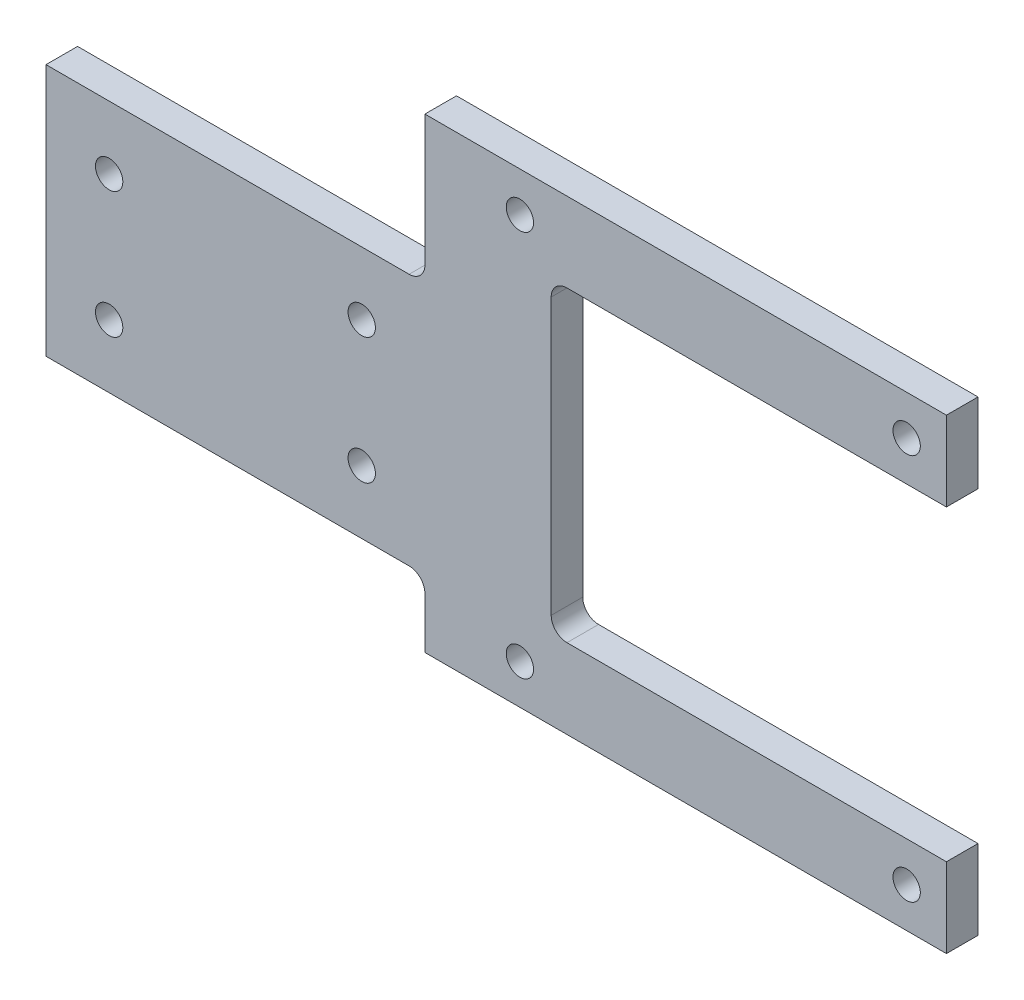
ISO-10303-21;
HEADER;
FILE_DESCRIPTION(('STEP AP214'),'2;1');
FILE_NAME('part.step','',(''),(''),'','','');
FILE_SCHEMA(('AUTOMOTIVE_DESIGN { 1 0 10303 214 1 1 1 1 }'));
ENDSEC;
DATA;
#1=APPLICATION_CONTEXT('core data for automotive mechanical design processes');
#2=APPLICATION_PROTOCOL_DEFINITION('international standard','automotive_design',2000,#1);
#3=PRODUCT_CONTEXT('',#1,'mechanical');
#4=PRODUCT('Part','Part','',(#3));
#5=PRODUCT_RELATED_PRODUCT_CATEGORY('part','',(#4));
#6=PRODUCT_DEFINITION_FORMATION('','',#4);
#7=PRODUCT_DEFINITION_CONTEXT('part definition',#1,'design');
#8=PRODUCT_DEFINITION('design','',#6,#7);
#9=PRODUCT_DEFINITION_SHAPE('','',#8);
#10=(LENGTH_UNIT() NAMED_UNIT(*) SI_UNIT(.MILLI.,.METRE.));
#11=(NAMED_UNIT(*) PLANE_ANGLE_UNIT() SI_UNIT($,.RADIAN.));
#12=(NAMED_UNIT(*) SI_UNIT($,.STERADIAN.) SOLID_ANGLE_UNIT());
#13=UNCERTAINTY_MEASURE_WITH_UNIT(LENGTH_MEASURE(1.E-05),#10,'distance_accuracy_value','');
#14=(GEOMETRIC_REPRESENTATION_CONTEXT(3) GLOBAL_UNCERTAINTY_ASSIGNED_CONTEXT((#13)) GLOBAL_UNIT_ASSIGNED_CONTEXT((#10,
#11,#12)) REPRESENTATION_CONTEXT('',''));
#15=CARTESIAN_POINT('',(0.,0.,0.));
#16=DIRECTION('',(0.,0.,1.));
#17=DIRECTION('',(1.,0.,0.));
#18=AXIS2_PLACEMENT_3D('',#15,#16,#17);
#19=CARTESIAN_POINT('',(-38.1,25.4,6.35));
#20=DIRECTION('',(1.,0.,0.));
#21=DIRECTION('',(0.,0.,-1.));
#22=AXIS2_PLACEMENT_3D('',#19,#20,#21);
#23=PLANE('',#22);
#24=DIRECTION('',(0.,-1.,0.));
#25=VECTOR('',#24,1.);
#26=CARTESIAN_POINT('',(-38.1,25.4,0.));
#27=LINE('',#26,#25);
#28=CARTESIAN_POINT('',(-38.1,25.4,0.));
#29=VERTEX_POINT('',#28);
#30=CARTESIAN_POINT('',(-38.1,-25.4,0.));
#31=VERTEX_POINT('',#30);
#32=EDGE_CURVE('E173',#29,#31,#27,.T.);
#33=ORIENTED_EDGE('',*,*,#32,.T.);
#34=DIRECTION('',(0.,0.,-1.));
#35=VECTOR('',#34,1.);
#36=CARTESIAN_POINT('',(-38.1,-25.4,6.35));
#37=LINE('',#36,#35);
#38=CARTESIAN_POINT('',(-38.1,-25.4,6.35));
#39=VERTEX_POINT('',#38);
#40=EDGE_CURVE('E154',#39,#31,#37,.T.);
#41=ORIENTED_EDGE('',*,*,#40,.F.);
#42=DIRECTION('',(0.,-1.,0.));
#43=VECTOR('',#42,1.);
#44=CARTESIAN_POINT('',(-38.1,25.4,6.35));
#45=LINE('',#44,#43);
#46=CARTESIAN_POINT('',(-38.1,25.4,6.35));
#47=VERTEX_POINT('',#46);
#48=EDGE_CURVE('E161',#47,#39,#45,.T.);
#49=ORIENTED_EDGE('',*,*,#48,.F.);
#50=DIRECTION('',(0.,0.,-1.));
#51=VECTOR('',#50,1.);
#52=CARTESIAN_POINT('',(-38.1,25.4,6.35));
#53=LINE('',#52,#51);
#54=EDGE_CURVE('E263',#47,#29,#53,.T.);
#55=ORIENTED_EDGE('',*,*,#54,.T.);
#56=EDGE_LOOP('',(#33,#41,#49,#55));
#57=FACE_BOUND('',#56,.T.);
#58=ADVANCED_FACE('F35',(#57),#23,.F.);
#59=CARTESIAN_POINT('',(38.1,-25.4,6.35));
#60=DIRECTION('',(0.,1.,0.));
#61=DIRECTION('',(0.,0.,1.));
#62=AXIS2_PLACEMENT_3D('',#59,#60,#61);
#63=PLANE('',#62);
#64=DIRECTION('',(1.,0.,0.));
#65=VECTOR('',#64,1.);
#66=CARTESIAN_POINT('',(38.1,-25.4,0.));
#67=LINE('',#66,#65);
#68=CARTESIAN_POINT('',(34.925,-25.4,0.));
#69=VERTEX_POINT('',#68);
#70=EDGE_CURVE('E236',#31,#69,#67,.T.);
#71=ORIENTED_EDGE('',*,*,#70,.T.);
#72=DIRECTION('',(0.,0.,-1.));
#73=VECTOR('',#72,1.);
#74=CARTESIAN_POINT('',(34.925,-25.4,6.35));
#75=LINE('',#74,#73);
#76=CARTESIAN_POINT('',(34.925,-25.4,6.35));
#77=VERTEX_POINT('',#76);
#78=EDGE_CURVE('E157',#69,#77,#75,.F.);
#79=ORIENTED_EDGE('',*,*,#78,.T.);
#80=DIRECTION('',(1.,0.,0.));
#81=VECTOR('',#80,1.);
#82=CARTESIAN_POINT('',(38.1,-25.4,6.35));
#83=LINE('',#82,#81);
#84=EDGE_CURVE('E149',#39,#77,#83,.T.);
#85=ORIENTED_EDGE('',*,*,#84,.F.);
#86=ORIENTED_EDGE('',*,*,#40,.T.);
#87=EDGE_LOOP('',(#71,#79,#85,#86));
#88=FACE_BOUND('',#87,.T.);
#89=ADVANCED_FACE('F152',(#88),#63,.F.);
#90=CARTESIAN_POINT('',(38.1,-38.8908729652601,6.35));
#91=DIRECTION('',(1.,0.,0.));
#92=DIRECTION('',(0.,0.,-1.));
#93=AXIS2_PLACEMENT_3D('',#90,#91,#92);
#94=PLANE('',#93);
#95=DIRECTION('',(0.,-1.,0.));
#96=VECTOR('',#95,1.);
#97=CARTESIAN_POINT('',(38.1,-38.8908729652601,6.35));
#98=LINE('',#97,#96);
#99=CARTESIAN_POINT('',(38.1,-28.575,6.35));
#100=VERTEX_POINT('',#99);
#101=CARTESIAN_POINT('',(38.1,-38.8908729652601,6.35));
#102=VERTEX_POINT('',#101);
#103=EDGE_CURVE('E160',#100,#102,#98,.T.);
#104=ORIENTED_EDGE('',*,*,#103,.F.);
#105=DIRECTION('',(0.,0.,-1.));
#106=VECTOR('',#105,1.);
#107=CARTESIAN_POINT('',(38.1,-28.575,0.));
#108=LINE('',#107,#106);
#109=CARTESIAN_POINT('',(38.1,-28.575,0.));
#110=VERTEX_POINT('',#109);
#111=EDGE_CURVE('E204',#100,#110,#108,.T.);
#112=ORIENTED_EDGE('',*,*,#111,.T.);
#113=DIRECTION('',(0.,-1.,0.));
#114=VECTOR('',#113,1.);
#115=CARTESIAN_POINT('',(38.1,-38.8908729652601,0.));
#116=LINE('',#115,#114);
#117=CARTESIAN_POINT('',(38.1,-38.8908729652601,0.));
#118=VERTEX_POINT('',#117);
#119=EDGE_CURVE('E238',#110,#118,#116,.T.);
#120=ORIENTED_EDGE('',*,*,#119,.T.);
#121=DIRECTION('',(0.,0.,-1.));
#122=VECTOR('',#121,1.);
#123=CARTESIAN_POINT('',(38.1,-38.8908729652601,6.35));
#124=LINE('',#123,#122);
#125=EDGE_CURVE('E175',#102,#118,#124,.T.);
#126=ORIENTED_EDGE('',*,*,#125,.F.);
#127=EDGE_LOOP('',(#104,#112,#120,#126));
#128=FACE_BOUND('',#127,.T.);
#129=ADVANCED_FACE('F229',(#128),#94,.F.);
#130=CARTESIAN_POINT('',(142.99087296526,-38.8908729652601,6.35));
#131=DIRECTION('',(0.,1.,0.));
#132=DIRECTION('',(-1.,0.,0.));
#133=AXIS2_PLACEMENT_3D('',#130,#131,#132);
#134=PLANE('',#133);
#135=DIRECTION('',(1.,0.,0.));
#136=VECTOR('',#135,1.);
#137=CARTESIAN_POINT('',(142.99087296526,-38.8908729652601,0.));
#138=LINE('',#137,#136);
#139=CARTESIAN_POINT('',(142.99087296526,-38.8908729652601,0.));
#140=VERTEX_POINT('',#139);
#141=EDGE_CURVE('E240',#118,#140,#138,.T.);
#142=ORIENTED_EDGE('',*,*,#141,.T.);
#143=DIRECTION('',(0.,0.,-1.));
#144=VECTOR('',#143,1.);
#145=CARTESIAN_POINT('',(142.99087296526,-38.8908729652601,6.35));
#146=LINE('',#145,#144);
#147=CARTESIAN_POINT('',(142.99087296526,-38.8908729652601,6.35));
#148=VERTEX_POINT('',#147);
#149=EDGE_CURVE('E181',#148,#140,#146,.T.);
#150=ORIENTED_EDGE('',*,*,#149,.F.);
#151=DIRECTION('',(1.,0.,0.));
#152=VECTOR('',#151,1.);
#153=CARTESIAN_POINT('',(142.99087296526,-38.8908729652601,6.35));
#154=LINE('',#153,#152);
#155=EDGE_CURVE('E232',#102,#148,#154,.T.);
#156=ORIENTED_EDGE('',*,*,#155,.F.);
#157=ORIENTED_EDGE('',*,*,#125,.T.);
#158=EDGE_LOOP('',(#142,#150,#156,#157));
#159=FACE_BOUND('',#158,.T.);
#160=ADVANCED_FACE('F418',(#159),#134,.F.);
#161=CARTESIAN_POINT('',(142.99087296526,-22.8908729652601,6.35));
#162=DIRECTION('',(-1.,0.,0.));
#163=DIRECTION('',(0.,0.,1.));
#164=AXIS2_PLACEMENT_3D('',#161,#162,#163);
#165=PLANE('',#164);
#166=DIRECTION('',(0.,1.,0.));
#167=VECTOR('',#166,1.);
#168=CARTESIAN_POINT('',(142.99087296526,-22.8908729652601,0.));
#169=LINE('',#168,#167);
#170=CARTESIAN_POINT('',(142.99087296526,-22.8908729652601,0.));
#171=VERTEX_POINT('',#170);
#172=EDGE_CURVE('E246',#140,#171,#169,.T.);
#173=ORIENTED_EDGE('',*,*,#172,.T.);
#174=DIRECTION('',(0.,0.,-1.));
#175=VECTOR('',#174,1.);
#176=CARTESIAN_POINT('',(142.99087296526,-22.8908729652601,6.35));
#177=LINE('',#176,#175);
#178=CARTESIAN_POINT('',(142.99087296526,-22.8908729652601,6.35));
#179=VERTEX_POINT('',#178);
#180=EDGE_CURVE('E274',#179,#171,#177,.T.);
#181=ORIENTED_EDGE('',*,*,#180,.F.);
#182=DIRECTION('',(0.,1.,0.));
#183=VECTOR('',#182,1.);
#184=CARTESIAN_POINT('',(142.99087296526,-22.8908729652601,6.35));
#185=LINE('',#184,#183);
#186=EDGE_CURVE('E283',#148,#179,#185,.T.);
#187=ORIENTED_EDGE('',*,*,#186,.F.);
#188=ORIENTED_EDGE('',*,*,#149,.T.);
#189=EDGE_LOOP('',(#173,#181,#187,#188));
#190=FACE_BOUND('',#189,.T.);
#191=ADVANCED_FACE('F281',(#190),#165,.F.);
#192=CARTESIAN_POINT('',(63.5,-22.8908729652601,6.35));
#193=DIRECTION('',(0.,-1.,0.));
#194=DIRECTION('',(1.,0.,0.));
#195=AXIS2_PLACEMENT_3D('',#192,#193,#194);
#196=PLANE('',#195);
#197=DIRECTION('',(-1.,0.,0.));
#198=VECTOR('',#197,1.);
#199=CARTESIAN_POINT('',(63.5,-22.8908729652601,0.));
#200=LINE('',#199,#198);
#201=CARTESIAN_POINT('',(66.675,-22.8908729652601,0.));
#202=VERTEX_POINT('',#201);
#203=EDGE_CURVE('E248',#171,#202,#200,.T.);
#204=ORIENTED_EDGE('',*,*,#203,.T.);
#205=DIRECTION('',(0.,0.,-1.));
#206=VECTOR('',#205,1.);
#207=CARTESIAN_POINT('',(66.675,-22.8908729652601,6.35));
#208=LINE('',#207,#206);
#209=CARTESIAN_POINT('',(66.675,-22.8908729652601,6.35));
#210=VERTEX_POINT('',#209);
#211=EDGE_CURVE('E202',#202,#210,#208,.F.);
#212=ORIENTED_EDGE('',*,*,#211,.T.);
#213=DIRECTION('',(-1.,0.,0.));
#214=VECTOR('',#213,1.);
#215=CARTESIAN_POINT('',(63.5,-22.8908729652601,6.35));
#216=LINE('',#215,#214);
#217=EDGE_CURVE('E300',#179,#210,#216,.T.);
#218=ORIENTED_EDGE('',*,*,#217,.F.);
#219=ORIENTED_EDGE('',*,*,#180,.T.);
#220=EDGE_LOOP('',(#204,#212,#218,#219));
#221=FACE_BOUND('',#220,.T.);
#222=ADVANCED_FACE('F289',(#221),#196,.F.);
#223=CARTESIAN_POINT('',(63.5,38.8908729652602,6.35));
#224=DIRECTION('',(-1.,0.,0.));
#225=DIRECTION('',(0.,-1.,0.));
#226=AXIS2_PLACEMENT_3D('',#223,#224,#225);
#227=PLANE('',#226);
#228=DIRECTION('',(0.,1.,0.));
#229=VECTOR('',#228,1.);
#230=CARTESIAN_POINT('',(63.5,38.8908729652602,0.));
#231=LINE('',#230,#229);
#232=CARTESIAN_POINT('',(63.5,-19.7158729652601,0.));
#233=VERTEX_POINT('',#232);
#234=CARTESIAN_POINT('',(63.5,35.7158729652602,0.));
#235=VERTEX_POINT('',#234);
#236=EDGE_CURVE('E251',#233,#235,#231,.T.);
#237=ORIENTED_EDGE('',*,*,#236,.T.);
#238=DIRECTION('',(0.,0.,-1.));
#239=VECTOR('',#238,1.);
#240=CARTESIAN_POINT('',(63.5,35.7158729652602,6.35));
#241=LINE('',#240,#239);
#242=CARTESIAN_POINT('',(63.5,35.7158729652602,6.35));
#243=VERTEX_POINT('',#242);
#244=EDGE_CURVE('E200',#235,#243,#241,.F.);
#245=ORIENTED_EDGE('',*,*,#244,.T.);
#246=DIRECTION('',(0.,1.,0.));
#247=VECTOR('',#246,1.);
#248=CARTESIAN_POINT('',(63.5,38.8908729652602,6.35));
#249=LINE('',#248,#247);
#250=CARTESIAN_POINT('',(63.5,-19.7158729652601,6.35));
#251=VERTEX_POINT('',#250);
#252=EDGE_CURVE('E298',#251,#243,#249,.T.);
#253=ORIENTED_EDGE('',*,*,#252,.F.);
#254=DIRECTION('',(0.,0.,-1.));
#255=VECTOR('',#254,1.);
#256=CARTESIAN_POINT('',(63.5,-19.7158729652601,0.));
#257=LINE('',#256,#255);
#258=EDGE_CURVE('E178',#251,#233,#257,.T.);
#259=ORIENTED_EDGE('',*,*,#258,.T.);
#260=EDGE_LOOP('',(#237,#245,#253,#259));
#261=FACE_BOUND('',#260,.T.);
#262=ADVANCED_FACE('F302',(#261),#227,.F.);
#263=CARTESIAN_POINT('',(142.99087296526,38.8908729652602,6.35));
#264=DIRECTION('',(0.,1.,0.));
#265=DIRECTION('',(-1.,0.,0.));
#266=AXIS2_PLACEMENT_3D('',#263,#264,#265);
#267=PLANE('',#266);
#268=DIRECTION('',(1.,0.,0.));
#269=VECTOR('',#268,1.);
#270=CARTESIAN_POINT('',(142.99087296526,38.8908729652602,6.35));
#271=LINE('',#270,#269);
#272=CARTESIAN_POINT('',(66.675,38.8908729652602,6.35));
#273=VERTEX_POINT('',#272);
#274=CARTESIAN_POINT('',(142.99087296526,38.8908729652602,6.35));
#275=VERTEX_POINT('',#274);
#276=EDGE_CURVE('E304',#273,#275,#271,.T.);
#277=ORIENTED_EDGE('',*,*,#276,.F.);
#278=DIRECTION('',(0.,0.,-1.));
#279=VECTOR('',#278,1.);
#280=CARTESIAN_POINT('',(66.675,38.8908729652602,0.));
#281=LINE('',#280,#279);
#282=CARTESIAN_POINT('',(66.675,38.8908729652602,0.));
#283=VERTEX_POINT('',#282);
#284=EDGE_CURVE('E174',#273,#283,#281,.T.);
#285=ORIENTED_EDGE('',*,*,#284,.T.);
#286=DIRECTION('',(1.,0.,0.));
#287=VECTOR('',#286,1.);
#288=CARTESIAN_POINT('',(142.99087296526,38.8908729652602,0.));
#289=LINE('',#288,#287);
#290=CARTESIAN_POINT('',(142.99087296526,38.8908729652602,0.));
#291=VERTEX_POINT('',#290);
#292=EDGE_CURVE('E254',#283,#291,#289,.T.);
#293=ORIENTED_EDGE('',*,*,#292,.T.);
#294=DIRECTION('',(0.,0.,-1.));
#295=VECTOR('',#294,1.);
#296=CARTESIAN_POINT('',(142.99087296526,38.8908729652602,6.35));
#297=LINE('',#296,#295);
#298=EDGE_CURVE('E271',#275,#291,#297,.T.);
#299=ORIENTED_EDGE('',*,*,#298,.F.);
#300=EDGE_LOOP('',(#277,#285,#293,#299));
#301=FACE_BOUND('',#300,.T.);
#302=ADVANCED_FACE('F431',(#301),#267,.F.);
#303=CARTESIAN_POINT('',(142.99087296526,54.8908729652602,6.35));
#304=DIRECTION('',(-1.,0.,0.));
#305=DIRECTION('',(0.,0.,1.));
#306=AXIS2_PLACEMENT_3D('',#303,#304,#305);
#307=PLANE('',#306);
#308=DIRECTION('',(0.,1.,0.));
#309=VECTOR('',#308,1.);
#310=CARTESIAN_POINT('',(142.99087296526,54.8908729652602,0.));
#311=LINE('',#310,#309);
#312=CARTESIAN_POINT('',(142.99087296526,54.8908729652602,0.));
#313=VERTEX_POINT('',#312);
#314=EDGE_CURVE('E256',#291,#313,#311,.T.);
#315=ORIENTED_EDGE('',*,*,#314,.T.);
#316=DIRECTION('',(0.,0.,-1.));
#317=VECTOR('',#316,1.);
#318=CARTESIAN_POINT('',(142.99087296526,54.8908729652602,6.35));
#319=LINE('',#318,#317);
#320=CARTESIAN_POINT('',(142.99087296526,54.8908729652602,6.35));
#321=VERTEX_POINT('',#320);
#322=EDGE_CURVE('E268',#321,#313,#319,.T.);
#323=ORIENTED_EDGE('',*,*,#322,.F.);
#324=DIRECTION('',(0.,1.,0.));
#325=VECTOR('',#324,1.);
#326=CARTESIAN_POINT('',(142.99087296526,54.8908729652602,6.35));
#327=LINE('',#326,#325);
#328=EDGE_CURVE('E306',#275,#321,#327,.T.);
#329=ORIENTED_EDGE('',*,*,#328,.F.);
#330=ORIENTED_EDGE('',*,*,#298,.T.);
#331=EDGE_LOOP('',(#315,#323,#329,#330));
#332=FACE_BOUND('',#331,.T.);
#333=ADVANCED_FACE('F434',(#332),#307,.F.);
#334=CARTESIAN_POINT('',(38.1,54.8908729652602,6.35));
#335=DIRECTION('',(0.,-1.,0.));
#336=DIRECTION('',(1.,0.,0.));
#337=AXIS2_PLACEMENT_3D('',#334,#335,#336);
#338=PLANE('',#337);
#339=DIRECTION('',(-1.,0.,0.));
#340=VECTOR('',#339,1.);
#341=CARTESIAN_POINT('',(38.1,54.8908729652602,0.));
#342=LINE('',#341,#340);
#343=CARTESIAN_POINT('',(38.1,54.8908729652602,0.));
#344=VERTEX_POINT('',#343);
#345=EDGE_CURVE('E258',#313,#344,#342,.T.);
#346=ORIENTED_EDGE('',*,*,#345,.T.);
#347=DIRECTION('',(0.,0.,-1.));
#348=VECTOR('',#347,1.);
#349=CARTESIAN_POINT('',(38.1,54.8908729652602,6.35));
#350=LINE('',#349,#348);
#351=CARTESIAN_POINT('',(38.1,54.8908729652602,6.35));
#352=VERTEX_POINT('',#351);
#353=EDGE_CURVE('E265',#352,#344,#350,.T.);
#354=ORIENTED_EDGE('',*,*,#353,.F.);
#355=DIRECTION('',(-1.,0.,0.));
#356=VECTOR('',#355,1.);
#357=CARTESIAN_POINT('',(38.1,54.8908729652602,6.35));
#358=LINE('',#357,#356);
#359=EDGE_CURVE('E312',#321,#352,#358,.T.);
#360=ORIENTED_EDGE('',*,*,#359,.F.);
#361=ORIENTED_EDGE('',*,*,#322,.T.);
#362=EDGE_LOOP('',(#346,#354,#360,#361));
#363=FACE_BOUND('',#362,.T.);
#364=ADVANCED_FACE('F331',(#363),#338,.F.);
#365=CARTESIAN_POINT('',(38.1,25.4,6.35));
#366=DIRECTION('',(1.,0.,0.));
#367=DIRECTION('',(0.,0.,-1.));
#368=AXIS2_PLACEMENT_3D('',#365,#366,#367);
#369=PLANE('',#368);
#370=DIRECTION('',(0.,-1.,0.));
#371=VECTOR('',#370,1.);
#372=CARTESIAN_POINT('',(38.1,25.4,0.));
#373=LINE('',#372,#371);
#374=CARTESIAN_POINT('',(38.1,28.575,0.));
#375=VERTEX_POINT('',#374);
#376=EDGE_CURVE('E260',#344,#375,#373,.T.);
#377=ORIENTED_EDGE('',*,*,#376,.T.);
#378=DIRECTION('',(0.,0.,-1.));
#379=VECTOR('',#378,1.);
#380=CARTESIAN_POINT('',(38.1,28.575,6.35));
#381=LINE('',#380,#379);
#382=CARTESIAN_POINT('',(38.1,28.575,6.35));
#383=VERTEX_POINT('',#382);
#384=EDGE_CURVE('E51',#375,#383,#381,.F.);
#385=ORIENTED_EDGE('',*,*,#384,.T.);
#386=DIRECTION('',(0.,-1.,0.));
#387=VECTOR('',#386,1.);
#388=CARTESIAN_POINT('',(38.1,25.4,6.35));
#389=LINE('',#388,#387);
#390=EDGE_CURVE('E314',#352,#383,#389,.T.);
#391=ORIENTED_EDGE('',*,*,#390,.F.);
#392=ORIENTED_EDGE('',*,*,#353,.T.);
#393=EDGE_LOOP('',(#377,#385,#391,#392));
#394=FACE_BOUND('',#393,.T.);
#395=ADVANCED_FACE('F323',(#394),#369,.F.);
#396=CARTESIAN_POINT('',(38.1,25.4,6.35));
#397=DIRECTION('',(0.,-1.,0.));
#398=DIRECTION('',(0.,0.,-1.));
#399=AXIS2_PLACEMENT_3D('',#396,#397,#398);
#400=PLANE('',#399);
#401=DIRECTION('',(-1.,0.,0.));
#402=VECTOR('',#401,1.);
#403=CARTESIAN_POINT('',(38.1,25.4,6.35));
#404=LINE('',#403,#402);
#405=CARTESIAN_POINT('',(34.925,25.4,6.35));
#406=VERTEX_POINT('',#405);
#407=EDGE_CURVE('E166',#406,#47,#404,.T.);
#408=ORIENTED_EDGE('',*,*,#407,.F.);
#409=DIRECTION('',(0.,0.,-1.));
#410=VECTOR('',#409,1.);
#411=CARTESIAN_POINT('',(34.925,25.4,0.));
#412=LINE('',#411,#410);
#413=CARTESIAN_POINT('',(34.925,25.4,0.));
#414=VERTEX_POINT('',#413);
#415=EDGE_CURVE('E208',#406,#414,#412,.T.);
#416=ORIENTED_EDGE('',*,*,#415,.T.);
#417=DIRECTION('',(-1.,0.,0.));
#418=VECTOR('',#417,1.);
#419=CARTESIAN_POINT('',(38.1,25.4,0.));
#420=LINE('',#419,#418);
#421=EDGE_CURVE('E170',#414,#29,#420,.T.);
#422=ORIENTED_EDGE('',*,*,#421,.T.);
#423=ORIENTED_EDGE('',*,*,#54,.F.);
#424=EDGE_LOOP('',(#408,#416,#422,#423));
#425=FACE_BOUND('',#424,.T.);
#426=ADVANCED_FACE('F321',(#425),#400,.F.);
#427=CARTESIAN_POINT('',(0.,0.,6.35));
#428=DIRECTION('',(0.,0.,-1.));
#429=DIRECTION('',(-1.,0.,0.));
#430=AXIS2_PLACEMENT_3D('',#427,#428,#429);
#431=PLANE('',#430);
#432=CARTESIAN_POINT('',(-25.4,12.7,6.35));
#433=DIRECTION('',(0.,0.,1.));
#434=DIRECTION('',(1.,0.,0.));
#435=AXIS2_PLACEMENT_3D('',#432,#433,#434);
#436=CIRCLE('',#435,2.74999999999999);
#437=CARTESIAN_POINT('',(-22.65,12.7,6.35));
#438=VERTEX_POINT('',#437);
#439=EDGE_CURVE('E533',#438,#438,#436,.T.);
#440=ORIENTED_EDGE('',*,*,#439,.F.);
#441=EDGE_LOOP('',(#440));
#442=FACE_BOUND('',#441,.T.);
#443=CARTESIAN_POINT('',(25.4,12.7,6.35));
#444=DIRECTION('',(0.,0.,1.));
#445=DIRECTION('',(1.,0.,0.));
#446=AXIS2_PLACEMENT_3D('',#443,#444,#445);
#447=CIRCLE('',#446,2.74999999999999);
#448=CARTESIAN_POINT('',(28.15,12.7,6.35));
#449=VERTEX_POINT('',#448);
#450=EDGE_CURVE('E535',#449,#449,#447,.T.);
#451=ORIENTED_EDGE('',*,*,#450,.F.);
#452=EDGE_LOOP('',(#451));
#453=FACE_BOUND('',#452,.T.);
#454=CARTESIAN_POINT('',(25.4,-12.7,6.35));
#455=DIRECTION('',(0.,0.,1.));
#456=DIRECTION('',(1.,0.,0.));
#457=AXIS2_PLACEMENT_3D('',#454,#455,#456);
#458=CIRCLE('',#457,2.74999999999999);
#459=CARTESIAN_POINT('',(28.15,-12.7,6.35));
#460=VERTEX_POINT('',#459);
#461=EDGE_CURVE('E540',#460,#460,#458,.T.);
#462=ORIENTED_EDGE('',*,*,#461,.F.);
#463=EDGE_LOOP('',(#462));
#464=FACE_BOUND('',#463,.T.);
#465=CARTESIAN_POINT('',(-25.4,-12.7,6.35));
#466=DIRECTION('',(0.,0.,1.));
#467=DIRECTION('',(1.,0.,0.));
#468=AXIS2_PLACEMENT_3D('',#465,#466,#467);
#469=CIRCLE('',#468,2.74999999999999);
#470=CARTESIAN_POINT('',(-22.65,-12.7,6.35));
#471=VERTEX_POINT('',#470);
#472=EDGE_CURVE('E544',#471,#471,#469,.T.);
#473=ORIENTED_EDGE('',*,*,#472,.F.);
#474=EDGE_LOOP('',(#473));
#475=FACE_BOUND('',#474,.T.);
#476=CARTESIAN_POINT('',(134.99087296526,46.89087296526,6.35));
#477=DIRECTION('',(0.,0.,1.));
#478=DIRECTION('',(1.,0.,0.));
#479=AXIS2_PLACEMENT_3D('',#476,#477,#478);
#480=CIRCLE('',#479,2.75);
#481=CARTESIAN_POINT('',(137.74087296526,46.89087296526,6.35));
#482=VERTEX_POINT('',#481);
#483=EDGE_CURVE('E196',#482,#482,#480,.T.);
#484=ORIENTED_EDGE('',*,*,#483,.F.);
#485=EDGE_LOOP('',(#484));
#486=FACE_BOUND('',#485,.T.);
#487=CARTESIAN_POINT('',(134.99087296526,-30.8908729652598,6.35));
#488=DIRECTION('',(0.,0.,1.));
#489=DIRECTION('',(1.,0.,0.));
#490=AXIS2_PLACEMENT_3D('',#487,#488,#489);
#491=CIRCLE('',#490,2.75);
#492=CARTESIAN_POINT('',(137.74087296526,-30.8908729652598,6.35));
#493=VERTEX_POINT('',#492);
#494=EDGE_CURVE('E193',#493,#493,#491,.T.);
#495=ORIENTED_EDGE('',*,*,#494,.F.);
#496=EDGE_LOOP('',(#495));
#497=FACE_BOUND('',#496,.T.);
#498=CARTESIAN_POINT('',(57.2091270347394,46.89087296526,6.35));
#499=DIRECTION('',(0.,0.,1.));
#500=DIRECTION('',(1.,0.,0.));
#501=AXIS2_PLACEMENT_3D('',#498,#499,#500);
#502=CIRCLE('',#501,2.75);
#503=CARTESIAN_POINT('',(59.9591270347394,46.89087296526,6.35));
#504=VERTEX_POINT('',#503);
#505=EDGE_CURVE('E192',#504,#504,#502,.T.);
#506=ORIENTED_EDGE('',*,*,#505,.F.);
#507=EDGE_LOOP('',(#506));
#508=FACE_BOUND('',#507,.T.);
#509=CARTESIAN_POINT('',(57.2091270347397,-30.8908729652599,6.35));
#510=DIRECTION('',(0.,0.,1.));
#511=DIRECTION('',(1.,0.,0.));
#512=AXIS2_PLACEMENT_3D('',#509,#510,#511);
#513=CIRCLE('',#512,2.75);
#514=CARTESIAN_POINT('',(59.9591270347397,-30.8908729652599,6.35));
#515=VERTEX_POINT('',#514);
#516=EDGE_CURVE('E188',#515,#515,#513,.T.);
#517=ORIENTED_EDGE('',*,*,#516,.F.);
#518=EDGE_LOOP('',(#517));
#519=FACE_BOUND('',#518,.T.);
#520=ORIENTED_EDGE('',*,*,#48,.T.);
#521=ORIENTED_EDGE('',*,*,#84,.T.);
#522=CARTESIAN_POINT('',(34.925,-28.575,6.35));
#523=DIRECTION('',(0.,0.,-1.));
#524=DIRECTION('',(-1.,0.,0.));
#525=AXIS2_PLACEMENT_3D('',#522,#523,#524);
#526=CIRCLE('',#525,3.175);
#527=EDGE_CURVE('E222',#77,#100,#526,.T.);
#528=ORIENTED_EDGE('',*,*,#527,.T.);
#529=ORIENTED_EDGE('',*,*,#103,.T.);
#530=ORIENTED_EDGE('',*,*,#155,.T.);
#531=ORIENTED_EDGE('',*,*,#186,.T.);
#532=ORIENTED_EDGE('',*,*,#217,.T.);
#533=CARTESIAN_POINT('',(66.675,-19.7158729652601,6.35));
#534=DIRECTION('',(0.,0.,-1.));
#535=DIRECTION('',(-1.,0.,0.));
#536=AXIS2_PLACEMENT_3D('',#533,#534,#535);
#537=CIRCLE('',#536,3.175);
#538=EDGE_CURVE('E218',#210,#251,#537,.T.);
#539=ORIENTED_EDGE('',*,*,#538,.T.);
#540=ORIENTED_EDGE('',*,*,#252,.T.);
#541=CARTESIAN_POINT('',(66.675,35.7158729652602,6.35));
#542=DIRECTION('',(0.,0.,-1.));
#543=DIRECTION('',(-1.,0.,0.));
#544=AXIS2_PLACEMENT_3D('',#541,#542,#543);
#545=CIRCLE('',#544,3.175);
#546=EDGE_CURVE('E214',#243,#273,#545,.T.);
#547=ORIENTED_EDGE('',*,*,#546,.T.);
#548=ORIENTED_EDGE('',*,*,#276,.T.);
#549=ORIENTED_EDGE('',*,*,#328,.T.);
#550=ORIENTED_EDGE('',*,*,#359,.T.);
#551=ORIENTED_EDGE('',*,*,#390,.T.);
#552=CARTESIAN_POINT('',(34.925,28.575,6.35));
#553=DIRECTION('',(0.,0.,-1.));
#554=DIRECTION('',(-1.,0.,0.));
#555=AXIS2_PLACEMENT_3D('',#552,#553,#554);
#556=CIRCLE('',#555,3.175);
#557=EDGE_CURVE('E11',#383,#406,#556,.T.);
#558=ORIENTED_EDGE('',*,*,#557,.T.);
#559=ORIENTED_EDGE('',*,*,#407,.T.);
#560=EDGE_LOOP('',(#520,#521,#528,#529,#530,#531,#532,#539,#540,#547,#548,#549,#550,#551,#558,#559));
#561=FACE_BOUND('',#560,.T.);
#562=ADVANCED_FACE('F164',(#442,#453,#464,#475,#486,#497,#508,#519,#561),#431,.F.);
#563=CARTESIAN_POINT('',(0.,0.,0.));
#564=DIRECTION('',(0.,0.,-1.));
#565=DIRECTION('',(-1.,0.,0.));
#566=AXIS2_PLACEMENT_3D('',#563,#564,#565);
#567=PLANE('',#566);
#568=CARTESIAN_POINT('',(-25.4,12.7,0.));
#569=DIRECTION('',(0.,0.,-1.));
#570=DIRECTION('',(-1.,0.,0.));
#571=AXIS2_PLACEMENT_3D('',#568,#569,#570);
#572=CIRCLE('',#571,2.74999999999999);
#573=CARTESIAN_POINT('',(-28.15,12.7,0.));
#574=VERTEX_POINT('',#573);
#575=EDGE_CURVE('E390',#574,#574,#572,.T.);
#576=ORIENTED_EDGE('',*,*,#575,.F.);
#577=EDGE_LOOP('',(#576));
#578=FACE_BOUND('',#577,.T.);
#579=CARTESIAN_POINT('',(25.4,12.7,0.));
#580=DIRECTION('',(0.,0.,-1.));
#581=DIRECTION('',(-1.,0.,0.));
#582=AXIS2_PLACEMENT_3D('',#579,#580,#581);
#583=CIRCLE('',#582,2.74999999999999);
#584=CARTESIAN_POINT('',(22.65,12.7,0.));
#585=VERTEX_POINT('',#584);
#586=EDGE_CURVE('E39',#585,#585,#583,.T.);
#587=ORIENTED_EDGE('',*,*,#586,.F.);
#588=EDGE_LOOP('',(#587));
#589=FACE_BOUND('',#588,.T.);
#590=CARTESIAN_POINT('',(25.4,-12.7,0.));
#591=DIRECTION('',(0.,0.,-1.));
#592=DIRECTION('',(-1.,0.,0.));
#593=AXIS2_PLACEMENT_3D('',#590,#591,#592);
#594=CIRCLE('',#593,2.74999999999999);
#595=CARTESIAN_POINT('',(22.65,-12.7,0.));
#596=VERTEX_POINT('',#595);
#597=EDGE_CURVE('E397',#596,#596,#594,.T.);
#598=ORIENTED_EDGE('',*,*,#597,.F.);
#599=EDGE_LOOP('',(#598));
#600=FACE_BOUND('',#599,.T.);
#601=CARTESIAN_POINT('',(-25.4,-12.7,0.));
#602=DIRECTION('',(0.,0.,-1.));
#603=DIRECTION('',(-1.,0.,0.));
#604=AXIS2_PLACEMENT_3D('',#601,#602,#603);
#605=CIRCLE('',#604,2.74999999999999);
#606=CARTESIAN_POINT('',(-28.15,-12.7,0.));
#607=VERTEX_POINT('',#606);
#608=EDGE_CURVE('E400',#607,#607,#605,.T.);
#609=ORIENTED_EDGE('',*,*,#608,.F.);
#610=EDGE_LOOP('',(#609));
#611=FACE_BOUND('',#610,.T.);
#612=CARTESIAN_POINT('',(134.99087296526,46.89087296526,0.));
#613=DIRECTION('',(0.,0.,-1.));
#614=DIRECTION('',(-1.,0.,0.));
#615=AXIS2_PLACEMENT_3D('',#612,#613,#614);
#616=CIRCLE('',#615,2.75);
#617=CARTESIAN_POINT('',(132.24087296526,46.89087296526,0.));
#618=VERTEX_POINT('',#617);
#619=EDGE_CURVE('E194',#618,#618,#616,.T.);
#620=ORIENTED_EDGE('',*,*,#619,.F.);
#621=EDGE_LOOP('',(#620));
#622=FACE_BOUND('',#621,.T.);
#623=CARTESIAN_POINT('',(134.99087296526,-30.8908729652598,0.));
#624=DIRECTION('',(0.,0.,-1.));
#625=DIRECTION('',(-1.,0.,0.));
#626=AXIS2_PLACEMENT_3D('',#623,#624,#625);
#627=CIRCLE('',#626,2.75);
#628=CARTESIAN_POINT('',(132.24087296526,-30.8908729652598,0.));
#629=VERTEX_POINT('',#628);
#630=EDGE_CURVE('E189',#629,#629,#627,.T.);
#631=ORIENTED_EDGE('',*,*,#630,.F.);
#632=EDGE_LOOP('',(#631));
#633=FACE_BOUND('',#632,.T.);
#634=CARTESIAN_POINT('',(57.2091270347394,46.89087296526,0.));
#635=DIRECTION('',(0.,0.,-1.));
#636=DIRECTION('',(-1.,0.,0.));
#637=AXIS2_PLACEMENT_3D('',#634,#635,#636);
#638=CIRCLE('',#637,2.75);
#639=CARTESIAN_POINT('',(54.4591270347394,46.89087296526,0.));
#640=VERTEX_POINT('',#639);
#641=EDGE_CURVE('E408',#640,#640,#638,.T.);
#642=ORIENTED_EDGE('',*,*,#641,.F.);
#643=EDGE_LOOP('',(#642));
#644=FACE_BOUND('',#643,.T.);
#645=CARTESIAN_POINT('',(57.2091270347397,-30.8908729652599,0.));
#646=DIRECTION('',(0.,0.,-1.));
#647=DIRECTION('',(-1.,0.,0.));
#648=AXIS2_PLACEMENT_3D('',#645,#646,#647);
#649=CIRCLE('',#648,2.75);
#650=CARTESIAN_POINT('',(54.4591270347397,-30.8908729652599,0.));
#651=VERTEX_POINT('',#650);
#652=EDGE_CURVE('E185',#651,#651,#649,.T.);
#653=ORIENTED_EDGE('',*,*,#652,.F.);
#654=EDGE_LOOP('',(#653));
#655=FACE_BOUND('',#654,.T.);
#656=ORIENTED_EDGE('',*,*,#32,.F.);
#657=ORIENTED_EDGE('',*,*,#421,.F.);
#658=CARTESIAN_POINT('',(34.925,28.575,0.));
#659=DIRECTION('',(0.,0.,-1.));
#660=DIRECTION('',(-1.,0.,0.));
#661=AXIS2_PLACEMENT_3D('',#658,#659,#660);
#662=CIRCLE('',#661,3.175);
#663=EDGE_CURVE('E44',#414,#375,#662,.F.);
#664=ORIENTED_EDGE('',*,*,#663,.T.);
#665=ORIENTED_EDGE('',*,*,#376,.F.);
#666=ORIENTED_EDGE('',*,*,#345,.F.);
#667=ORIENTED_EDGE('',*,*,#314,.F.);
#668=ORIENTED_EDGE('',*,*,#292,.F.);
#669=CARTESIAN_POINT('',(66.675,35.7158729652602,0.));
#670=DIRECTION('',(0.,0.,-1.));
#671=DIRECTION('',(-1.,0.,0.));
#672=AXIS2_PLACEMENT_3D('',#669,#670,#671);
#673=CIRCLE('',#672,3.175);
#674=EDGE_CURVE('E212',#283,#235,#673,.F.);
#675=ORIENTED_EDGE('',*,*,#674,.T.);
#676=ORIENTED_EDGE('',*,*,#236,.F.);
#677=CARTESIAN_POINT('',(66.675,-19.7158729652601,0.));
#678=DIRECTION('',(0.,0.,-1.));
#679=DIRECTION('',(-1.,0.,0.));
#680=AXIS2_PLACEMENT_3D('',#677,#678,#679);
#681=CIRCLE('',#680,3.175);
#682=EDGE_CURVE('E216',#233,#202,#681,.F.);
#683=ORIENTED_EDGE('',*,*,#682,.T.);
#684=ORIENTED_EDGE('',*,*,#203,.F.);
#685=ORIENTED_EDGE('',*,*,#172,.F.);
#686=ORIENTED_EDGE('',*,*,#141,.F.);
#687=ORIENTED_EDGE('',*,*,#119,.F.);
#688=CARTESIAN_POINT('',(34.925,-28.575,0.));
#689=DIRECTION('',(0.,0.,-1.));
#690=DIRECTION('',(-1.,0.,0.));
#691=AXIS2_PLACEMENT_3D('',#688,#689,#690);
#692=CIRCLE('',#691,3.175);
#693=EDGE_CURVE('E220',#110,#69,#692,.F.);
#694=ORIENTED_EDGE('',*,*,#693,.T.);
#695=ORIENTED_EDGE('',*,*,#70,.F.);
#696=EDGE_LOOP('',(#656,#657,#664,#665,#666,#667,#668,#675,#676,#683,#684,#685,#686,#687,#694,#695));
#697=FACE_BOUND('',#696,.T.);
#698=ADVANCED_FACE('F235',(#578,#589,#600,#611,#622,#633,#644,#655,#697),#567,.T.);
#699=CARTESIAN_POINT('',(57.2091270347397,-30.8908729652599,6.35));
#700=DIRECTION('',(0.,0.,1.));
#701=DIRECTION('',(1.,0.,0.));
#702=AXIS2_PLACEMENT_3D('',#699,#700,#701);
#703=CYLINDRICAL_SURFACE('',#702,2.75);
#704=ORIENTED_EDGE('',*,*,#652,.T.);
#705=EDGE_LOOP('',(#704));
#706=FACE_BOUND('',#705,.T.);
#707=ORIENTED_EDGE('',*,*,#516,.T.);
#708=EDGE_LOOP('',(#707));
#709=FACE_BOUND('',#708,.T.);
#710=ADVANCED_FACE('F379',(#706,#709),#703,.F.);
#711=CARTESIAN_POINT('',(57.2091270347394,46.89087296526,6.35));
#712=DIRECTION('',(0.,0.,1.));
#713=DIRECTION('',(1.,0.,0.));
#714=AXIS2_PLACEMENT_3D('',#711,#712,#713);
#715=CYLINDRICAL_SURFACE('',#714,2.75);
#716=ORIENTED_EDGE('',*,*,#641,.T.);
#717=EDGE_LOOP('',(#716));
#718=FACE_BOUND('',#717,.T.);
#719=ORIENTED_EDGE('',*,*,#505,.T.);
#720=EDGE_LOOP('',(#719));
#721=FACE_BOUND('',#720,.T.);
#722=ADVANCED_FACE('F375',(#718,#721),#715,.F.);
#723=CARTESIAN_POINT('',(134.99087296526,-30.8908729652598,6.35));
#724=DIRECTION('',(0.,0.,1.));
#725=DIRECTION('',(1.,0.,0.));
#726=AXIS2_PLACEMENT_3D('',#723,#724,#725);
#727=CYLINDRICAL_SURFACE('',#726,2.75);
#728=ORIENTED_EDGE('',*,*,#630,.T.);
#729=EDGE_LOOP('',(#728));
#730=FACE_BOUND('',#729,.T.);
#731=ORIENTED_EDGE('',*,*,#494,.T.);
#732=EDGE_LOOP('',(#731));
#733=FACE_BOUND('',#732,.T.);
#734=ADVANCED_FACE('F371',(#730,#733),#727,.F.);
#735=CARTESIAN_POINT('',(134.99087296526,46.89087296526,6.35));
#736=DIRECTION('',(0.,0.,1.));
#737=DIRECTION('',(1.,0.,0.));
#738=AXIS2_PLACEMENT_3D('',#735,#736,#737);
#739=CYLINDRICAL_SURFACE('',#738,2.75);
#740=ORIENTED_EDGE('',*,*,#619,.T.);
#741=EDGE_LOOP('',(#740));
#742=FACE_BOUND('',#741,.T.);
#743=ORIENTED_EDGE('',*,*,#483,.T.);
#744=EDGE_LOOP('',(#743));
#745=FACE_BOUND('',#744,.T.);
#746=ADVANCED_FACE('F345',(#742,#745),#739,.F.);
#747=CARTESIAN_POINT('',(66.675,35.7158729652602,6.35));
#748=DIRECTION('',(0.,0.,1.));
#749=DIRECTION('',(1.,0.,0.));
#750=AXIS2_PLACEMENT_3D('',#747,#748,#749);
#751=CYLINDRICAL_SURFACE('',#750,3.175);
#752=ORIENTED_EDGE('',*,*,#546,.F.);
#753=ORIENTED_EDGE('',*,*,#244,.F.);
#754=ORIENTED_EDGE('',*,*,#674,.F.);
#755=ORIENTED_EDGE('',*,*,#284,.F.);
#756=EDGE_LOOP('',(#752,#753,#754,#755));
#757=FACE_BOUND('',#756,.T.);
#758=ADVANCED_FACE('F342',(#757),#751,.F.);
#759=CARTESIAN_POINT('',(66.675,-19.7158729652601,6.35));
#760=DIRECTION('',(0.,0.,1.));
#761=DIRECTION('',(1.,0.,0.));
#762=AXIS2_PLACEMENT_3D('',#759,#760,#761);
#763=CYLINDRICAL_SURFACE('',#762,3.175);
#764=ORIENTED_EDGE('',*,*,#538,.F.);
#765=ORIENTED_EDGE('',*,*,#211,.F.);
#766=ORIENTED_EDGE('',*,*,#682,.F.);
#767=ORIENTED_EDGE('',*,*,#258,.F.);
#768=EDGE_LOOP('',(#764,#765,#766,#767));
#769=FACE_BOUND('',#768,.T.);
#770=ADVANCED_FACE('F294',(#769),#763,.F.);
#771=CARTESIAN_POINT('',(34.925,-28.575,6.35));
#772=DIRECTION('',(0.,0.,1.));
#773=DIRECTION('',(1.,0.,0.));
#774=AXIS2_PLACEMENT_3D('',#771,#772,#773);
#775=CYLINDRICAL_SURFACE('',#774,3.175);
#776=ORIENTED_EDGE('',*,*,#527,.F.);
#777=ORIENTED_EDGE('',*,*,#78,.F.);
#778=ORIENTED_EDGE('',*,*,#693,.F.);
#779=ORIENTED_EDGE('',*,*,#111,.F.);
#780=EDGE_LOOP('',(#776,#777,#778,#779));
#781=FACE_BOUND('',#780,.T.);
#782=ADVANCED_FACE('F234',(#781),#775,.F.);
#783=CARTESIAN_POINT('',(34.925,28.575,6.35));
#784=DIRECTION('',(0.,0.,1.));
#785=DIRECTION('',(1.,0.,0.));
#786=AXIS2_PLACEMENT_3D('',#783,#784,#785);
#787=CYLINDRICAL_SURFACE('',#786,3.175);
#788=ORIENTED_EDGE('',*,*,#557,.F.);
#789=ORIENTED_EDGE('',*,*,#384,.F.);
#790=ORIENTED_EDGE('',*,*,#663,.F.);
#791=ORIENTED_EDGE('',*,*,#415,.F.);
#792=EDGE_LOOP('',(#788,#789,#790,#791));
#793=FACE_BOUND('',#792,.T.);
#794=ADVANCED_FACE('F37',(#793),#787,.F.);
#795=CARTESIAN_POINT('',(-25.4,-12.7,6.35));
#796=DIRECTION('',(0.,0.,1.));
#797=DIRECTION('',(1.,0.,0.));
#798=AXIS2_PLACEMENT_3D('',#795,#796,#797);
#799=CYLINDRICAL_SURFACE('',#798,2.74999999999999);
#800=ORIENTED_EDGE('',*,*,#608,.T.);
#801=EDGE_LOOP('',(#800));
#802=FACE_BOUND('',#801,.T.);
#803=ORIENTED_EDGE('',*,*,#472,.T.);
#804=EDGE_LOOP('',(#803));
#805=FACE_BOUND('',#804,.T.);
#806=ADVANCED_FACE('F352',(#802,#805),#799,.F.);
#807=CARTESIAN_POINT('',(25.4,-12.7,6.35));
#808=DIRECTION('',(0.,0.,1.));
#809=DIRECTION('',(1.,0.,0.));
#810=AXIS2_PLACEMENT_3D('',#807,#808,#809);
#811=CYLINDRICAL_SURFACE('',#810,2.74999999999999);
#812=ORIENTED_EDGE('',*,*,#597,.T.);
#813=EDGE_LOOP('',(#812));
#814=FACE_BOUND('',#813,.T.);
#815=ORIENTED_EDGE('',*,*,#461,.T.);
#816=EDGE_LOOP('',(#815));
#817=FACE_BOUND('',#816,.T.);
#818=ADVANCED_FACE('F356',(#814,#817),#811,.F.);
#819=CARTESIAN_POINT('',(25.4,12.7,6.35));
#820=DIRECTION('',(0.,0.,1.));
#821=DIRECTION('',(1.,0.,0.));
#822=AXIS2_PLACEMENT_3D('',#819,#820,#821);
#823=CYLINDRICAL_SURFACE('',#822,2.74999999999999);
#824=ORIENTED_EDGE('',*,*,#586,.T.);
#825=EDGE_LOOP('',(#824));
#826=FACE_BOUND('',#825,.T.);
#827=ORIENTED_EDGE('',*,*,#450,.T.);
#828=EDGE_LOOP('',(#827));
#829=FACE_BOUND('',#828,.T.);
#830=ADVANCED_FACE('F362',(#826,#829),#823,.F.);
#831=CARTESIAN_POINT('',(-25.4,12.7,6.35));
#832=DIRECTION('',(0.,0.,1.));
#833=DIRECTION('',(1.,0.,0.));
#834=AXIS2_PLACEMENT_3D('',#831,#832,#833);
#835=CYLINDRICAL_SURFACE('',#834,2.74999999999999);
#836=ORIENTED_EDGE('',*,*,#575,.T.);
#837=EDGE_LOOP('',(#836));
#838=FACE_BOUND('',#837,.T.);
#839=ORIENTED_EDGE('',*,*,#439,.T.);
#840=EDGE_LOOP('',(#839));
#841=FACE_BOUND('',#840,.T.);
#842=ADVANCED_FACE('F517',(#838,#841),#835,.F.);
#843=CLOSED_SHELL('',(#58,#89,#129,#160,#191,#222,#262,#302,#333,#364,#395,#426,#562,#698,#710,
#722,#734,#746,#758,#770,#782,#794,#806,#818,#830,#842));
#844=MANIFOLD_SOLID_BREP('B2',#843);
#845=ADVANCED_BREP_SHAPE_REPRESENTATION('',(#18,#844),#14);
#846=SHAPE_DEFINITION_REPRESENTATION(#9,#845);
ENDSEC;
END-ISO-10303-21;
